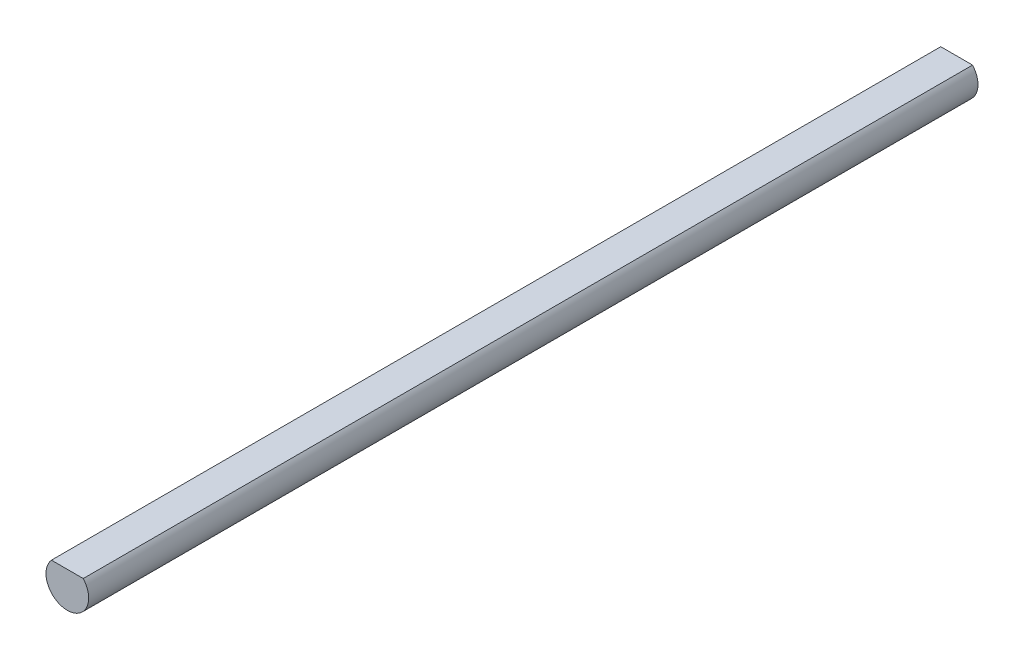
ISO-10303-21;
HEADER;
FILE_DESCRIPTION(('STEP AP214'),'2;1');
FILE_NAME('part.step','',(''),(''),'','','');
FILE_SCHEMA(('AUTOMOTIVE_DESIGN { 1 0 10303 214 1 1 1 1 }'));
ENDSEC;
DATA;
#1=APPLICATION_CONTEXT('core data for automotive mechanical design processes');
#2=APPLICATION_PROTOCOL_DEFINITION('international standard','automotive_design',2000,#1);
#3=PRODUCT_CONTEXT('',#1,'mechanical');
#4=PRODUCT('Part','Part','',(#3));
#5=PRODUCT_RELATED_PRODUCT_CATEGORY('part','',(#4));
#6=PRODUCT_DEFINITION_FORMATION('','',#4);
#7=PRODUCT_DEFINITION_CONTEXT('part definition',#1,'design');
#8=PRODUCT_DEFINITION('design','',#6,#7);
#9=PRODUCT_DEFINITION_SHAPE('','',#8);
#10=(LENGTH_UNIT() NAMED_UNIT(*) SI_UNIT(.MILLI.,.METRE.));
#11=(NAMED_UNIT(*) PLANE_ANGLE_UNIT() SI_UNIT($,.RADIAN.));
#12=(NAMED_UNIT(*) SI_UNIT($,.STERADIAN.) SOLID_ANGLE_UNIT());
#13=UNCERTAINTY_MEASURE_WITH_UNIT(LENGTH_MEASURE(1.E-05),#10,'distance_accuracy_value','');
#14=(GEOMETRIC_REPRESENTATION_CONTEXT(3) GLOBAL_UNCERTAINTY_ASSIGNED_CONTEXT((#13)) GLOBAL_UNIT_ASSIGNED_CONTEXT((#10,
#11,#12)) REPRESENTATION_CONTEXT('',''));
#15=CARTESIAN_POINT('',(0.,0.,0.));
#16=DIRECTION('',(0.,0.,1.));
#17=DIRECTION('',(1.,0.,0.));
#18=AXIS2_PLACEMENT_3D('',#15,#16,#17);
#19=CARTESIAN_POINT('',(0.,3.00000000000001,62.5));
#20=DIRECTION('',(0.,0.,-1.));
#21=DIRECTION('',(0.,1.,0.));
#22=AXIS2_PLACEMENT_3D('',#19,#20,#21);
#23=PLANE('',#22);
#24=CARTESIAN_POINT('',(0.,0.,62.5));
#25=DIRECTION('',(0.,0.,1.));
#26=DIRECTION('',(0.,-1.,0.));
#27=AXIS2_PLACEMENT_3D('',#24,#25,#26);
#28=CIRCLE('',#27,3.);
#29=CARTESIAN_POINT('',(-2.2360679774998,2.,62.5));
#30=VERTEX_POINT('',#29);
#31=CARTESIAN_POINT('',(2.2360679774998,2.,62.5));
#32=VERTEX_POINT('',#31);
#33=EDGE_CURVE('E64',#30,#32,#28,.T.);
#34=ORIENTED_EDGE('',*,*,#33,.T.);
#35=DIRECTION('',(1.,0.,0.));
#36=VECTOR('',#35,1.);
#37=CARTESIAN_POINT('',(-5.41444970293834,2.,62.5));
#38=LINE('',#37,#36);
#39=EDGE_CURVE('E56',#30,#32,#38,.T.);
#40=ORIENTED_EDGE('',*,*,#39,.F.);
#41=EDGE_LOOP('',(#34,#40));
#42=FACE_BOUND('',#41,.T.);
#43=ADVANCED_FACE('F33',(#42),#23,.F.);
#44=CARTESIAN_POINT('',(0.,3.00000000000001,-62.5));
#45=DIRECTION('',(0.,0.,1.));
#46=DIRECTION('',(0.,-1.,0.));
#47=AXIS2_PLACEMENT_3D('',#44,#45,#46);
#48=PLANE('',#47);
#49=CARTESIAN_POINT('',(0.,0.,-62.5));
#50=DIRECTION('',(0.,0.,1.));
#51=DIRECTION('',(0.,-1.,0.));
#52=AXIS2_PLACEMENT_3D('',#49,#50,#51);
#53=CIRCLE('',#52,3.);
#54=CARTESIAN_POINT('',(-2.2360679774998,2.,-62.5));
#55=VERTEX_POINT('',#54);
#56=CARTESIAN_POINT('',(2.2360679774998,2.,-62.5));
#57=VERTEX_POINT('',#56);
#58=EDGE_CURVE('E61',#55,#57,#53,.T.);
#59=ORIENTED_EDGE('',*,*,#58,.F.);
#60=DIRECTION('',(1.,0.,0.));
#61=VECTOR('',#60,1.);
#62=CARTESIAN_POINT('',(-5.41444970293834,2.,-62.5));
#63=LINE('',#62,#61);
#64=EDGE_CURVE('E47',#55,#57,#63,.T.);
#65=ORIENTED_EDGE('',*,*,#64,.T.);
#66=EDGE_LOOP('',(#59,#65));
#67=FACE_BOUND('',#66,.T.);
#68=ADVANCED_FACE('F71',(#67),#48,.F.);
#69=CARTESIAN_POINT('',(0.,0.,62.5));
#70=DIRECTION('',(0.,0.,1.));
#71=DIRECTION('',(0.,-1.,0.));
#72=AXIS2_PLACEMENT_3D('',#69,#70,#71);
#73=CYLINDRICAL_SURFACE('',#72,3.);
#74=ORIENTED_EDGE('',*,*,#58,.T.);
#75=DIRECTION('',(0.,0.,1.));
#76=VECTOR('',#75,1.);
#77=CARTESIAN_POINT('',(2.2360679774998,2.,62.5));
#78=LINE('',#77,#76);
#79=EDGE_CURVE('E11',#57,#32,#78,.T.);
#80=ORIENTED_EDGE('',*,*,#79,.T.);
#81=ORIENTED_EDGE('',*,*,#33,.F.);
#82=DIRECTION('',(0.,0.,1.));
#83=VECTOR('',#82,1.);
#84=CARTESIAN_POINT('',(-2.2360679774998,2.,62.5));
#85=LINE('',#84,#83);
#86=EDGE_CURVE('E40',#30,#55,#85,.F.);
#87=ORIENTED_EDGE('',*,*,#86,.T.);
#88=EDGE_LOOP('',(#74,#80,#81,#87));
#89=FACE_BOUND('',#88,.T.);
#90=ADVANCED_FACE('F66',(#89),#73,.T.);
#91=CARTESIAN_POINT('',(-5.41444970293834,2.,-62.5));
#92=DIRECTION('',(0.,-1.,0.));
#93=DIRECTION('',(0.,0.,-1.));
#94=AXIS2_PLACEMENT_3D('',#91,#92,#93);
#95=PLANE('',#94);
#96=ORIENTED_EDGE('',*,*,#64,.F.);
#97=ORIENTED_EDGE('',*,*,#86,.F.);
#98=ORIENTED_EDGE('',*,*,#39,.T.);
#99=ORIENTED_EDGE('',*,*,#79,.F.);
#100=EDGE_LOOP('',(#96,#97,#98,#99));
#101=FACE_BOUND('',#100,.T.);
#102=ADVANCED_FACE('F55',(#101),#95,.F.);
#103=CLOSED_SHELL('',(#43,#68,#90,#102));
#104=MANIFOLD_SOLID_BREP('B2',#103);
#105=ADVANCED_BREP_SHAPE_REPRESENTATION('',(#18,#104),#14);
#106=SHAPE_DEFINITION_REPRESENTATION(#9,#105);
ENDSEC;
END-ISO-10303-21;
